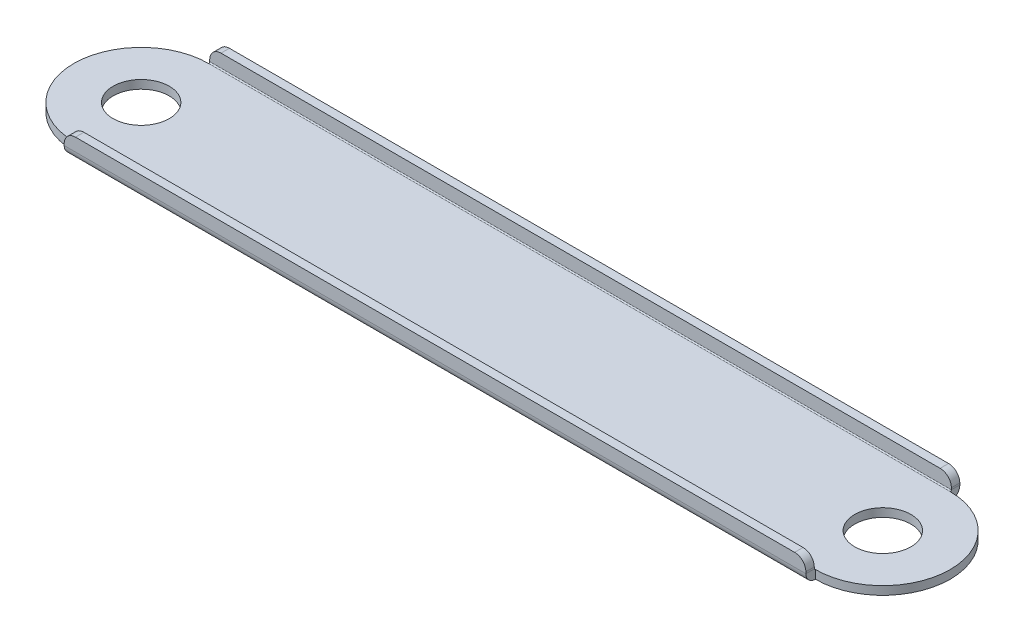
ISO-10303-21;
HEADER;
FILE_DESCRIPTION(('STEP AP214'),'2;1');
FILE_NAME('part.step','',(''),(''),'','','');
FILE_SCHEMA(('AUTOMOTIVE_DESIGN { 1 0 10303 214 1 1 1 1 }'));
ENDSEC;
DATA;
#1=APPLICATION_CONTEXT('core data for automotive mechanical design processes');
#2=APPLICATION_PROTOCOL_DEFINITION('international standard','automotive_design',2000,#1);
#3=PRODUCT_CONTEXT('',#1,'mechanical');
#4=PRODUCT('Part','Part','',(#3));
#5=PRODUCT_RELATED_PRODUCT_CATEGORY('part','',(#4));
#6=PRODUCT_DEFINITION_FORMATION('','',#4);
#7=PRODUCT_DEFINITION_CONTEXT('part definition',#1,'design');
#8=PRODUCT_DEFINITION('design','',#6,#7);
#9=PRODUCT_DEFINITION_SHAPE('','',#8);
#10=(LENGTH_UNIT() NAMED_UNIT(*) SI_UNIT(.MILLI.,.METRE.));
#11=(NAMED_UNIT(*) PLANE_ANGLE_UNIT() SI_UNIT($,.RADIAN.));
#12=(NAMED_UNIT(*) SI_UNIT($,.STERADIAN.) SOLID_ANGLE_UNIT());
#13=UNCERTAINTY_MEASURE_WITH_UNIT(LENGTH_MEASURE(1.E-05),#10,'distance_accuracy_value','');
#14=(GEOMETRIC_REPRESENTATION_CONTEXT(3) GLOBAL_UNCERTAINTY_ASSIGNED_CONTEXT((#13)) GLOBAL_UNIT_ASSIGNED_CONTEXT((#10,
#11,#12)) REPRESENTATION_CONTEXT('',''));
#15=CARTESIAN_POINT('',(0.,0.,0.));
#16=DIRECTION('',(0.,0.,1.));
#17=DIRECTION('',(1.,0.,0.));
#18=AXIS2_PLACEMENT_3D('',#15,#16,#17);
#19=CARTESIAN_POINT('',(-33.0009469561102,-0.75,0.));
#20=DIRECTION('',(0.,1.,0.));
#21=DIRECTION('',(0.,0.,1.));
#22=AXIS2_PLACEMENT_3D('',#19,#20,#21);
#23=CYLINDRICAL_SURFACE('',#22,6.);
#24=CARTESIAN_POINT('',(-33.0009469561102,0.,0.));
#25=DIRECTION('',(0.,1.,0.));
#26=DIRECTION('',(0.,0.,1.));
#27=AXIS2_PLACEMENT_3D('',#24,#25,#26);
#28=CIRCLE('',#27,6.);
#29=CARTESIAN_POINT('',(-33.0009469561102,0.,-6.));
#30=VERTEX_POINT('',#29);
#31=CARTESIAN_POINT('',(-33.0009469561102,0.,6.));
#32=VERTEX_POINT('',#31);
#33=EDGE_CURVE('E298',#30,#32,#28,.T.);
#34=ORIENTED_EDGE('',*,*,#33,.F.);
#35=DIRECTION('',(0.,1.,0.));
#36=VECTOR('',#35,1.);
#37=CARTESIAN_POINT('',(-33.0009469561102,-0.75,-6.));
#38=LINE('',#37,#36);
#39=CARTESIAN_POINT('',(-33.0009469561102,-0.750000000000001,-5.99999999999995));
#40=VERTEX_POINT('',#39);
#41=EDGE_CURVE('E322',#40,#30,#38,.T.);
#42=ORIENTED_EDGE('',*,*,#41,.F.);
#43=CARTESIAN_POINT('',(-33.0009469561102,-0.75,0.));
#44=DIRECTION('',(0.,1.,0.));
#45=DIRECTION('',(0.,0.,1.));
#46=AXIS2_PLACEMENT_3D('',#43,#44,#45);
#47=CIRCLE('',#46,6.);
#48=CARTESIAN_POINT('',(-33.0009469561102,-0.75,6.));
#49=VERTEX_POINT('',#48);
#50=EDGE_CURVE('E301',#40,#49,#47,.T.);
#51=ORIENTED_EDGE('',*,*,#50,.T.);
#52=DIRECTION('',(0.,1.,0.));
#53=VECTOR('',#52,1.);
#54=CARTESIAN_POINT('',(-33.0009469561102,-0.75,6.));
#55=LINE('',#54,#53);
#56=EDGE_CURVE('E311',#49,#32,#55,.T.);
#57=ORIENTED_EDGE('',*,*,#56,.T.);
#58=EDGE_LOOP('',(#34,#42,#51,#57));
#59=FACE_BOUND('',#58,.T.);
#60=ADVANCED_FACE('F78',(#59),#23,.T.);
#61=CARTESIAN_POINT('',(33.0009469561102,-0.75,0.));
#62=DIRECTION('',(0.,1.,0.));
#63=DIRECTION('',(0.,0.,1.));
#64=AXIS2_PLACEMENT_3D('',#61,#62,#63);
#65=CYLINDRICAL_SURFACE('',#64,6.);
#66=CARTESIAN_POINT('',(33.0009469561102,0.,0.));
#67=DIRECTION('',(0.,1.,0.));
#68=DIRECTION('',(0.,0.,1.));
#69=AXIS2_PLACEMENT_3D('',#66,#67,#68);
#70=CIRCLE('',#69,6.);
#71=CARTESIAN_POINT('',(33.0009469561102,0.,5.99999999999999));
#72=VERTEX_POINT('',#71);
#73=CARTESIAN_POINT('',(33.0009469561102,0.,-6.00000000000001));
#74=VERTEX_POINT('',#73);
#75=EDGE_CURVE('E317',#72,#74,#70,.T.);
#76=ORIENTED_EDGE('',*,*,#75,.F.);
#77=DIRECTION('',(0.,1.,0.));
#78=VECTOR('',#77,1.);
#79=CARTESIAN_POINT('',(33.0009469561102,-0.75,5.99999999999999));
#80=LINE('',#79,#78);
#81=CARTESIAN_POINT('',(33.0009469561102,-0.750000000000009,5.99999999999994));
#82=VERTEX_POINT('',#81);
#83=EDGE_CURVE('E327',#82,#72,#80,.T.);
#84=ORIENTED_EDGE('',*,*,#83,.F.);
#85=CARTESIAN_POINT('',(33.0009469561102,-0.75,0.));
#86=DIRECTION('',(0.,1.,0.));
#87=DIRECTION('',(0.,0.,1.));
#88=AXIS2_PLACEMENT_3D('',#85,#86,#87);
#89=CIRCLE('',#88,6.);
#90=CARTESIAN_POINT('',(33.0009469561102,-0.75,-6.00000000000001));
#91=VERTEX_POINT('',#90);
#92=EDGE_CURVE('E308',#82,#91,#89,.T.);
#93=ORIENTED_EDGE('',*,*,#92,.T.);
#94=DIRECTION('',(0.,1.,0.));
#95=VECTOR('',#94,1.);
#96=CARTESIAN_POINT('',(33.0009469561102,-0.75,-6.00000000000001));
#97=LINE('',#96,#95);
#98=EDGE_CURVE('E325',#91,#74,#97,.T.);
#99=ORIENTED_EDGE('',*,*,#98,.T.);
#100=EDGE_LOOP('',(#76,#84,#93,#99));
#101=FACE_BOUND('',#100,.T.);
#102=ADVANCED_FACE('F394',(#101),#65,.T.);
#103=CARTESIAN_POINT('',(-33.0009469561102,-0.75,0.));
#104=DIRECTION('',(0.,1.,0.));
#105=DIRECTION('',(0.,0.,1.));
#106=AXIS2_PLACEMENT_3D('',#103,#104,#105);
#107=PLANE('',#106);
#108=CARTESIAN_POINT('',(-33.0009469561102,-0.75,0.));
#109=DIRECTION('',(0.,1.,0.));
#110=DIRECTION('',(0.,0.,1.));
#111=AXIS2_PLACEMENT_3D('',#108,#109,#110);
#112=CIRCLE('',#111,2.5);
#113=CARTESIAN_POINT('',(-33.0009469561102,-0.75,2.50000000000001));
#114=VERTEX_POINT('',#113);
#115=EDGE_CURVE('E289',#114,#114,#112,.T.);
#116=ORIENTED_EDGE('',*,*,#115,.T.);
#117=EDGE_LOOP('',(#116));
#118=FACE_BOUND('',#117,.T.);
#119=CARTESIAN_POINT('',(33.0009469561102,-0.75,0.));
#120=DIRECTION('',(0.,1.,0.));
#121=DIRECTION('',(0.,0.,1.));
#122=AXIS2_PLACEMENT_3D('',#119,#120,#121);
#123=CIRCLE('',#122,2.5);
#124=CARTESIAN_POINT('',(33.0009469561102,-0.75,2.49999999999999));
#125=VERTEX_POINT('',#124);
#126=EDGE_CURVE('E295',#125,#125,#123,.T.);
#127=ORIENTED_EDGE('',*,*,#126,.T.);
#128=EDGE_LOOP('',(#127));
#129=FACE_BOUND('',#128,.T.);
#130=ORIENTED_EDGE('',*,*,#50,.F.);
#131=DIRECTION('',(-1.,0.,0.));
#132=VECTOR('',#131,1.);
#133=CARTESIAN_POINT('',(-33.0009469561102,-0.75,-6.));
#134=LINE('',#133,#132);
#135=EDGE_CURVE('E217',#91,#40,#134,.T.);
#136=ORIENTED_EDGE('',*,*,#135,.F.);
#137=ORIENTED_EDGE('',*,*,#92,.F.);
#138=DIRECTION('',(1.,0.,0.));
#139=VECTOR('',#138,1.);
#140=CARTESIAN_POINT('',(-33.0009469561102,-0.75,6.));
#141=LINE('',#140,#139);
#142=EDGE_CURVE('E304',#49,#82,#141,.T.);
#143=ORIENTED_EDGE('',*,*,#142,.F.);
#144=EDGE_LOOP('',(#130,#136,#137,#143));
#145=FACE_BOUND('',#144,.T.);
#146=ADVANCED_FACE('F396',(#118,#129,#145),#107,.F.);
#147=CARTESIAN_POINT('',(-33.0009469561102,0.,0.));
#148=DIRECTION('',(0.,1.,0.));
#149=DIRECTION('',(0.,0.,1.));
#150=AXIS2_PLACEMENT_3D('',#147,#148,#149);
#151=PLANE('',#150);
#152=CARTESIAN_POINT('',(-33.0009469561102,0.,0.));
#153=DIRECTION('',(0.,1.,0.));
#154=DIRECTION('',(0.,0.,1.));
#155=AXIS2_PLACEMENT_3D('',#152,#153,#154);
#156=CIRCLE('',#155,2.5);
#157=CARTESIAN_POINT('',(-33.0009469561102,0.,2.50000000000001));
#158=VERTEX_POINT('',#157);
#159=EDGE_CURVE('E280',#158,#158,#156,.T.);
#160=ORIENTED_EDGE('',*,*,#159,.F.);
#161=EDGE_LOOP('',(#160));
#162=FACE_BOUND('',#161,.T.);
#163=CARTESIAN_POINT('',(33.0009469561102,0.,0.));
#164=DIRECTION('',(0.,1.,0.));
#165=DIRECTION('',(0.,0.,1.));
#166=AXIS2_PLACEMENT_3D('',#163,#164,#165);
#167=CIRCLE('',#166,2.5);
#168=CARTESIAN_POINT('',(33.0009469561102,0.,2.49999999999999));
#169=VERTEX_POINT('',#168);
#170=EDGE_CURVE('E292',#169,#169,#167,.T.);
#171=ORIENTED_EDGE('',*,*,#170,.F.);
#172=EDGE_LOOP('',(#171));
#173=FACE_BOUND('',#172,.T.);
#174=ORIENTED_EDGE('',*,*,#33,.T.);
#175=DIRECTION('',(1.,0.,0.));
#176=VECTOR('',#175,1.);
#177=CARTESIAN_POINT('',(-33.0009469561102,0.,6.));
#178=LINE('',#177,#176);
#179=EDGE_CURVE('E314',#32,#72,#178,.T.);
#180=ORIENTED_EDGE('',*,*,#179,.T.);
#181=ORIENTED_EDGE('',*,*,#75,.T.);
#182=DIRECTION('',(-1.,0.,0.));
#183=VECTOR('',#182,1.);
#184=CARTESIAN_POINT('',(-33.0009469561102,0.,-6.));
#185=LINE('',#184,#183);
#186=EDGE_CURVE('E305',#74,#30,#185,.T.);
#187=ORIENTED_EDGE('',*,*,#186,.T.);
#188=EDGE_LOOP('',(#174,#180,#181,#187));
#189=FACE_BOUND('',#188,.T.);
#190=ADVANCED_FACE('F390',(#162,#173,#189),#151,.T.);
#191=CARTESIAN_POINT('',(33.0009469561102,-0.75,0.));
#192=DIRECTION('',(0.,1.,0.));
#193=DIRECTION('',(0.,0.,1.));
#194=AXIS2_PLACEMENT_3D('',#191,#192,#193);
#195=CYLINDRICAL_SURFACE('',#194,2.5);
#196=ORIENTED_EDGE('',*,*,#126,.F.);
#197=EDGE_LOOP('',(#196));
#198=FACE_BOUND('',#197,.T.);
#199=ORIENTED_EDGE('',*,*,#170,.T.);
#200=EDGE_LOOP('',(#199));
#201=FACE_BOUND('',#200,.T.);
#202=ADVANCED_FACE('F441',(#198,#201),#195,.F.);
#203=CARTESIAN_POINT('',(-33.0009469561102,-0.75,0.));
#204=DIRECTION('',(0.,1.,0.));
#205=DIRECTION('',(0.,0.,1.));
#206=AXIS2_PLACEMENT_3D('',#203,#204,#205);
#207=CYLINDRICAL_SURFACE('',#206,2.5);
#208=ORIENTED_EDGE('',*,*,#115,.F.);
#209=EDGE_LOOP('',(#208));
#210=FACE_BOUND('',#209,.T.);
#211=ORIENTED_EDGE('',*,*,#159,.T.);
#212=EDGE_LOOP('',(#211));
#213=FACE_BOUND('',#212,.T.);
#214=ADVANCED_FACE('F448',(#210,#213),#207,.F.);
#215=CARTESIAN_POINT('',(-33.0009469561102,0.0999999999999977,5.99999999999999));
#216=DIRECTION('',(-1.,0.,0.));
#217=DIRECTION('',(0.,0.,1.));
#218=AXIS2_PLACEMENT_3D('',#215,#216,#217);
#219=PLANE('',#218);
#220=DIRECTION('',(0.,0.,1.));
#221=VECTOR('',#220,1.);
#222=CARTESIAN_POINT('',(-33.0009469561102,0.0999999999999994,6.85));
#223=LINE('',#222,#221);
#224=CARTESIAN_POINT('',(-33.0009469561102,0.0999999999999972,6.1));
#225=VERTEX_POINT('',#224);
#226=CARTESIAN_POINT('',(-33.0009469561102,0.0999999999999941,6.85));
#227=VERTEX_POINT('',#226);
#228=EDGE_CURVE('E245',#225,#227,#223,.T.);
#229=ORIENTED_EDGE('',*,*,#228,.F.);
#230=CARTESIAN_POINT('',(-33.0009469561102,0.0999999999999977,5.99999999999999));
#231=DIRECTION('',(1.,0.,0.));
#232=DIRECTION('',(0.,0.,-1.));
#233=AXIS2_PLACEMENT_3D('',#230,#231,#232);
#234=CIRCLE('',#233,0.100000000000006);
#235=EDGE_CURVE('E284',#32,#225,#234,.F.);
#236=ORIENTED_EDGE('',*,*,#235,.F.);
#237=ORIENTED_EDGE('',*,*,#56,.F.);
#238=CARTESIAN_POINT('',(-33.0009469561102,0.0999999999999977,5.99999999999999));
#239=DIRECTION('',(1.,0.,0.));
#240=DIRECTION('',(0.,0.,-1.));
#241=AXIS2_PLACEMENT_3D('',#238,#239,#240);
#242=CIRCLE('',#241,0.850000000000006);
#243=EDGE_CURVE('E277',#49,#227,#242,.F.);
#244=ORIENTED_EDGE('',*,*,#243,.T.);
#245=EDGE_LOOP('',(#229,#236,#237,#244));
#246=FACE_BOUND('',#245,.T.);
#247=ADVANCED_FACE('F380',(#246),#219,.T.);
#248=CARTESIAN_POINT('',(33.0009469561102,0.0999999999999977,5.99999999999999));
#249=DIRECTION('',(-1.,0.,0.));
#250=DIRECTION('',(0.,0.,1.));
#251=AXIS2_PLACEMENT_3D('',#248,#249,#250);
#252=PLANE('',#251);
#253=CARTESIAN_POINT('',(33.0009469561102,0.0999999999999977,5.99999999999999));
#254=DIRECTION('',(1.,0.,0.));
#255=DIRECTION('',(0.,0.,-1.));
#256=AXIS2_PLACEMENT_3D('',#253,#254,#255);
#257=CIRCLE('',#256,0.100000000000006);
#258=CARTESIAN_POINT('',(33.0009469561102,0.0999999999999972,6.1));
#259=VERTEX_POINT('',#258);
#260=EDGE_CURVE('E252',#259,#72,#257,.T.);
#261=ORIENTED_EDGE('',*,*,#260,.F.);
#262=DIRECTION('',(0.,0.,1.));
#263=VECTOR('',#262,1.);
#264=CARTESIAN_POINT('',(33.0009469561102,0.0999999999999959,6.09999999999999));
#265=LINE('',#264,#263);
#266=CARTESIAN_POINT('',(33.0009469561102,0.0999999999999959,6.84999999999999));
#267=VERTEX_POINT('',#266);
#268=EDGE_CURVE('E269',#259,#267,#265,.T.);
#269=ORIENTED_EDGE('',*,*,#268,.T.);
#270=CARTESIAN_POINT('',(33.0009469561102,0.0999999999999977,5.99999999999999));
#271=DIRECTION('',(1.,0.,0.));
#272=DIRECTION('',(0.,0.,-1.));
#273=AXIS2_PLACEMENT_3D('',#270,#271,#272);
#274=CIRCLE('',#273,0.850000000000006);
#275=EDGE_CURVE('E281',#267,#82,#274,.T.);
#276=ORIENTED_EDGE('',*,*,#275,.T.);
#277=ORIENTED_EDGE('',*,*,#83,.T.);
#278=EDGE_LOOP('',(#261,#269,#276,#277));
#279=FACE_BOUND('',#278,.T.);
#280=ADVANCED_FACE('F374',(#279),#252,.F.);
#281=CARTESIAN_POINT('',(33.0009469561102,0.0999999999999977,5.99999999999999));
#282=DIRECTION('',(1.,0.,0.));
#283=DIRECTION('',(0.,0.,1.));
#284=AXIS2_PLACEMENT_3D('',#281,#282,#283);
#285=CYLINDRICAL_SURFACE('',#284,0.850000000000006);
#286=ORIENTED_EDGE('',*,*,#142,.T.);
#287=ORIENTED_EDGE('',*,*,#275,.F.);
#288=DIRECTION('',(1.,0.,0.));
#289=VECTOR('',#288,1.);
#290=CARTESIAN_POINT('',(0.,0.0999999999999977,6.84999999999999));
#291=LINE('',#290,#289);
#292=EDGE_CURVE('E266',#227,#267,#291,.T.);
#293=ORIENTED_EDGE('',*,*,#292,.F.);
#294=ORIENTED_EDGE('',*,*,#243,.F.);
#295=EDGE_LOOP('',(#286,#287,#293,#294));
#296=FACE_BOUND('',#295,.T.);
#297=ADVANCED_FACE('F377',(#296),#285,.T.);
#298=CARTESIAN_POINT('',(33.0009469561102,0.0999999999999977,5.99999999999999));
#299=DIRECTION('',(1.,0.,0.));
#300=DIRECTION('',(0.,0.,1.));
#301=AXIS2_PLACEMENT_3D('',#298,#299,#300);
#302=CYLINDRICAL_SURFACE('',#301,0.100000000000006);
#303=ORIENTED_EDGE('',*,*,#179,.F.);
#304=ORIENTED_EDGE('',*,*,#235,.T.);
#305=DIRECTION('',(-1.,0.,0.));
#306=VECTOR('',#305,1.);
#307=CARTESIAN_POINT('',(-33.0009469561102,0.0999999999999994,6.1));
#308=LINE('',#307,#306);
#309=EDGE_CURVE('E272',#225,#259,#308,.F.);
#310=ORIENTED_EDGE('',*,*,#309,.T.);
#311=ORIENTED_EDGE('',*,*,#260,.T.);
#312=EDGE_LOOP('',(#303,#304,#310,#311));
#313=FACE_BOUND('',#312,.T.);
#314=ADVANCED_FACE('F388',(#313),#302,.F.);
#315=CARTESIAN_POINT('',(33.0009469561102,0.,6.84999999999999));
#316=DIRECTION('',(1.,0.,0.));
#317=DIRECTION('',(0.,0.,-1.));
#318=AXIS2_PLACEMENT_3D('',#315,#316,#317);
#319=PLANE('',#318);
#320=DIRECTION('',(0.,1.,0.));
#321=VECTOR('',#320,1.);
#322=CARTESIAN_POINT('',(33.0009469561102,0.,6.09999999999999));
#323=LINE('',#322,#321);
#324=CARTESIAN_POINT('',(33.0009469561102,0.250000000000003,6.09999999999999));
#325=VERTEX_POINT('',#324);
#326=EDGE_CURVE('E258',#325,#259,#323,.F.);
#327=ORIENTED_EDGE('',*,*,#326,.F.);
#328=DIRECTION('',(0.,0.,-1.));
#329=VECTOR('',#328,1.);
#330=CARTESIAN_POINT('',(33.0009469561102,0.25,6.84999999999999));
#331=LINE('',#330,#329);
#332=CARTESIAN_POINT('',(33.0009469561102,0.25,6.84999999999999));
#333=VERTEX_POINT('',#332);
#334=EDGE_CURVE('E101',#325,#333,#331,.F.);
#335=ORIENTED_EDGE('',*,*,#334,.T.);
#336=DIRECTION('',(0.,-1.,0.));
#337=VECTOR('',#336,1.);
#338=CARTESIAN_POINT('',(33.0009469561102,0.,6.84999999999999));
#339=LINE('',#338,#337);
#340=EDGE_CURVE('E250',#333,#267,#339,.T.);
#341=ORIENTED_EDGE('',*,*,#340,.T.);
#342=ORIENTED_EDGE('',*,*,#268,.F.);
#343=EDGE_LOOP('',(#327,#335,#341,#342));
#344=FACE_BOUND('',#343,.T.);
#345=ADVANCED_FACE('F370',(#344),#319,.T.);
#346=CARTESIAN_POINT('',(-33.0009469561102,1.25,6.85));
#347=DIRECTION('',(-1.,0.,0.));
#348=DIRECTION('',(0.,0.,1.));
#349=AXIS2_PLACEMENT_3D('',#346,#347,#348);
#350=PLANE('',#349);
#351=DIRECTION('',(0.,1.,0.));
#352=VECTOR('',#351,1.);
#353=CARTESIAN_POINT('',(-33.0009469561102,1.25,6.85));
#354=LINE('',#353,#352);
#355=CARTESIAN_POINT('',(-33.0009469561102,0.25,6.85));
#356=VERTEX_POINT('',#355);
#357=EDGE_CURVE('E256',#227,#356,#354,.T.);
#358=ORIENTED_EDGE('',*,*,#357,.T.);
#359=DIRECTION('',(0.,0.,-1.));
#360=VECTOR('',#359,1.);
#361=CARTESIAN_POINT('',(-33.0009469561102,0.25,6.85));
#362=LINE('',#361,#360);
#363=CARTESIAN_POINT('',(-33.0009469561102,0.250000000000003,6.1));
#364=VERTEX_POINT('',#363);
#365=EDGE_CURVE('E13',#356,#364,#362,.T.);
#366=ORIENTED_EDGE('',*,*,#365,.T.);
#367=DIRECTION('',(0.,-1.,0.));
#368=VECTOR('',#367,1.);
#369=CARTESIAN_POINT('',(-33.0009469561102,0.,6.1));
#370=LINE('',#369,#368);
#371=EDGE_CURVE('E263',#225,#364,#370,.F.);
#372=ORIENTED_EDGE('',*,*,#371,.F.);
#373=ORIENTED_EDGE('',*,*,#228,.T.);
#374=EDGE_LOOP('',(#358,#366,#372,#373));
#375=FACE_BOUND('',#374,.T.);
#376=ADVANCED_FACE('F384',(#375),#350,.T.);
#377=CARTESIAN_POINT('',(0.,0.,6.84999999999999));
#378=DIRECTION('',(0.,0.,1.));
#379=DIRECTION('',(0.,-1.,0.));
#380=AXIS2_PLACEMENT_3D('',#377,#378,#379);
#381=PLANE('',#380);
#382=ORIENTED_EDGE('',*,*,#340,.F.);
#383=CARTESIAN_POINT('',(32.0009469561102,0.25,6.84999999999999));
#384=DIRECTION('',(0.,0.,1.));
#385=DIRECTION('',(0.,-1.,0.));
#386=AXIS2_PLACEMENT_3D('',#383,#384,#385);
#387=CIRCLE('',#386,1.);
#388=CARTESIAN_POINT('',(32.0009469561102,1.25,6.84999999999999));
#389=VERTEX_POINT('',#388);
#390=EDGE_CURVE('E86',#333,#389,#387,.T.);
#391=ORIENTED_EDGE('',*,*,#390,.T.);
#392=DIRECTION('',(1.,0.,0.));
#393=VECTOR('',#392,1.);
#394=CARTESIAN_POINT('',(33.0009469561102,1.25,6.84999999999999));
#395=LINE('',#394,#393);
#396=CARTESIAN_POINT('',(-32.0009469561102,1.25,6.85));
#397=VERTEX_POINT('',#396);
#398=EDGE_CURVE('E253',#397,#389,#395,.T.);
#399=ORIENTED_EDGE('',*,*,#398,.F.);
#400=CARTESIAN_POINT('',(-32.0009469561102,0.25,6.85));
#401=DIRECTION('',(0.,0.,1.));
#402=DIRECTION('',(0.,-1.,0.));
#403=AXIS2_PLACEMENT_3D('',#400,#401,#402);
#404=CIRCLE('',#403,1.);
#405=EDGE_CURVE('E93',#397,#356,#404,.T.);
#406=ORIENTED_EDGE('',*,*,#405,.T.);
#407=ORIENTED_EDGE('',*,*,#357,.F.);
#408=ORIENTED_EDGE('',*,*,#292,.T.);
#409=EDGE_LOOP('',(#382,#391,#399,#406,#407,#408));
#410=FACE_BOUND('',#409,.T.);
#411=ADVANCED_FACE('F358',(#410),#381,.T.);
#412=CARTESIAN_POINT('',(0.,0.,6.09999999999999));
#413=DIRECTION('',(0.,0.,1.));
#414=DIRECTION('',(0.,-1.,0.));
#415=AXIS2_PLACEMENT_3D('',#412,#413,#414);
#416=PLANE('',#415);
#417=DIRECTION('',(-1.,0.,0.));
#418=VECTOR('',#417,1.);
#419=CARTESIAN_POINT('',(0.,1.25,6.1));
#420=LINE('',#419,#418);
#421=CARTESIAN_POINT('',(-32.0009469561102,1.25,6.1));
#422=VERTEX_POINT('',#421);
#423=CARTESIAN_POINT('',(32.0009469561102,1.25,6.09999999999999));
#424=VERTEX_POINT('',#423);
#425=EDGE_CURVE('E260',#422,#424,#420,.F.);
#426=ORIENTED_EDGE('',*,*,#425,.T.);
#427=CARTESIAN_POINT('',(32.0009469561102,0.250000000000003,6.09999999999999));
#428=DIRECTION('',(0.,0.,1.));
#429=DIRECTION('',(0.,-1.,0.));
#430=AXIS2_PLACEMENT_3D('',#427,#428,#429);
#431=CIRCLE('',#430,1.);
#432=EDGE_CURVE('E354',#424,#325,#431,.F.);
#433=ORIENTED_EDGE('',*,*,#432,.T.);
#434=ORIENTED_EDGE('',*,*,#326,.T.);
#435=ORIENTED_EDGE('',*,*,#309,.F.);
#436=ORIENTED_EDGE('',*,*,#371,.T.);
#437=CARTESIAN_POINT('',(-32.0009469561102,0.250000000000003,6.1));
#438=DIRECTION('',(0.,0.,1.));
#439=DIRECTION('',(0.,-1.,0.));
#440=AXIS2_PLACEMENT_3D('',#437,#438,#439);
#441=CIRCLE('',#440,1.);
#442=EDGE_CURVE('E352',#364,#422,#441,.F.);
#443=ORIENTED_EDGE('',*,*,#442,.T.);
#444=EDGE_LOOP('',(#426,#433,#434,#435,#436,#443));
#445=FACE_BOUND('',#444,.T.);
#446=ADVANCED_FACE('F367',(#445),#416,.F.);
#447=CARTESIAN_POINT('',(33.0009469561102,1.25,6.84999999999999));
#448=DIRECTION('',(0.,1.,0.));
#449=DIRECTION('',(0.,0.,1.));
#450=AXIS2_PLACEMENT_3D('',#447,#448,#449);
#451=PLANE('',#450);
#452=ORIENTED_EDGE('',*,*,#398,.T.);
#453=DIRECTION('',(0.,0.,-1.));
#454=VECTOR('',#453,1.);
#455=CARTESIAN_POINT('',(32.0009469561102,1.25,6.84999999999999));
#456=LINE('',#455,#454);
#457=EDGE_CURVE('E349',#389,#424,#456,.T.);
#458=ORIENTED_EDGE('',*,*,#457,.T.);
#459=ORIENTED_EDGE('',*,*,#425,.F.);
#460=DIRECTION('',(0.,0.,-1.));
#461=VECTOR('',#460,1.);
#462=CARTESIAN_POINT('',(-32.0009469561102,1.25,6.85));
#463=LINE('',#462,#461);
#464=EDGE_CURVE('E347',#422,#397,#463,.F.);
#465=ORIENTED_EDGE('',*,*,#464,.T.);
#466=EDGE_LOOP('',(#452,#458,#459,#465));
#467=FACE_BOUND('',#466,.T.);
#468=ADVANCED_FACE('F362',(#467),#451,.T.);
#469=CARTESIAN_POINT('',(33.0009469561102,0.0999999999999987,-6.00000000000001));
#470=DIRECTION('',(1.,0.,0.));
#471=DIRECTION('',(0.,0.,-1.));
#472=AXIS2_PLACEMENT_3D('',#469,#470,#471);
#473=PLANE('',#472);
#474=DIRECTION('',(0.,0.,-1.));
#475=VECTOR('',#474,1.);
#476=CARTESIAN_POINT('',(33.0009469561102,0.100000000000005,-6.85));
#477=LINE('',#476,#475);
#478=CARTESIAN_POINT('',(33.0009469561102,0.0999999999999987,-6.10000000000001));
#479=VERTEX_POINT('',#478);
#480=CARTESIAN_POINT('',(33.0009469561102,0.0999999999999987,-6.85));
#481=VERTEX_POINT('',#480);
#482=EDGE_CURVE('E242',#479,#481,#477,.T.);
#483=ORIENTED_EDGE('',*,*,#482,.F.);
#484=CARTESIAN_POINT('',(33.0009469561102,0.0999999999999987,-6.00000000000001));
#485=DIRECTION('',(-1.,0.,0.));
#486=DIRECTION('',(0.,0.,1.));
#487=AXIS2_PLACEMENT_3D('',#484,#485,#486);
#488=CIRCLE('',#487,0.0999999999999994);
#489=EDGE_CURVE('E221',#74,#479,#488,.F.);
#490=ORIENTED_EDGE('',*,*,#489,.F.);
#491=ORIENTED_EDGE('',*,*,#98,.F.);
#492=CARTESIAN_POINT('',(33.0009469561102,0.0999999999999987,-6.00000000000001));
#493=DIRECTION('',(-1.,0.,0.));
#494=DIRECTION('',(0.,0.,1.));
#495=AXIS2_PLACEMENT_3D('',#492,#493,#494);
#496=CIRCLE('',#495,0.849999999999999);
#497=EDGE_CURVE('E220',#91,#481,#496,.F.);
#498=ORIENTED_EDGE('',*,*,#497,.T.);
#499=EDGE_LOOP('',(#483,#490,#491,#498));
#500=FACE_BOUND('',#499,.T.);
#501=ADVANCED_FACE('F465',(#500),#473,.T.);
#502=CARTESIAN_POINT('',(-33.0009469561102,0.0999999999999987,-6.00000000000001));
#503=DIRECTION('',(1.,0.,0.));
#504=DIRECTION('',(0.,0.,-1.));
#505=AXIS2_PLACEMENT_3D('',#502,#503,#504);
#506=PLANE('',#505);
#507=CARTESIAN_POINT('',(-33.0009469561102,0.0999999999999987,-6.00000000000001));
#508=DIRECTION('',(-1.,0.,0.));
#509=DIRECTION('',(0.,0.,1.));
#510=AXIS2_PLACEMENT_3D('',#507,#508,#509);
#511=CIRCLE('',#510,0.0999999999999994);
#512=CARTESIAN_POINT('',(-33.0009469561102,0.0999999999999987,-6.10000000000001));
#513=VERTEX_POINT('',#512);
#514=EDGE_CURVE('E205',#513,#30,#511,.T.);
#515=ORIENTED_EDGE('',*,*,#514,.F.);
#516=DIRECTION('',(0.,0.,-1.));
#517=VECTOR('',#516,1.);
#518=CARTESIAN_POINT('',(-33.0009469561102,0.0999999999999994,-6.10000000000001));
#519=LINE('',#518,#517);
#520=CARTESIAN_POINT('',(-33.0009469561102,0.100000000000005,-6.85));
#521=VERTEX_POINT('',#520);
#522=EDGE_CURVE('E199',#513,#521,#519,.T.);
#523=ORIENTED_EDGE('',*,*,#522,.T.);
#524=CARTESIAN_POINT('',(-33.0009469561102,0.0999999999999987,-6.00000000000001));
#525=DIRECTION('',(-1.,0.,0.));
#526=DIRECTION('',(0.,0.,1.));
#527=AXIS2_PLACEMENT_3D('',#524,#525,#526);
#528=CIRCLE('',#527,0.849999999999999);
#529=EDGE_CURVE('E211',#521,#40,#528,.T.);
#530=ORIENTED_EDGE('',*,*,#529,.T.);
#531=ORIENTED_EDGE('',*,*,#41,.T.);
#532=EDGE_LOOP('',(#515,#523,#530,#531));
#533=FACE_BOUND('',#532,.T.);
#534=ADVANCED_FACE('F224',(#533),#506,.F.);
#535=CARTESIAN_POINT('',(-33.0009469561102,0.0999999999999987,-6.00000000000001));
#536=DIRECTION('',(-1.,0.,0.));
#537=DIRECTION('',(0.,0.,-1.));
#538=AXIS2_PLACEMENT_3D('',#535,#536,#537);
#539=CYLINDRICAL_SURFACE('',#538,0.849999999999999);
#540=ORIENTED_EDGE('',*,*,#135,.T.);
#541=ORIENTED_EDGE('',*,*,#529,.F.);
#542=DIRECTION('',(-1.,0.,0.));
#543=VECTOR('',#542,1.);
#544=CARTESIAN_POINT('',(33.0009469561102,0.100000000000005,-6.85));
#545=LINE('',#544,#543);
#546=EDGE_CURVE('E214',#521,#481,#545,.F.);
#547=ORIENTED_EDGE('',*,*,#546,.T.);
#548=ORIENTED_EDGE('',*,*,#497,.F.);
#549=EDGE_LOOP('',(#540,#541,#547,#548));
#550=FACE_BOUND('',#549,.T.);
#551=ADVANCED_FACE('F212',(#550),#539,.T.);
#552=CARTESIAN_POINT('',(-33.0009469561102,0.0999999999999987,-6.00000000000001));
#553=DIRECTION('',(-1.,0.,0.));
#554=DIRECTION('',(0.,0.,-1.));
#555=AXIS2_PLACEMENT_3D('',#552,#553,#554);
#556=CYLINDRICAL_SURFACE('',#555,0.0999999999999994);
#557=ORIENTED_EDGE('',*,*,#186,.F.);
#558=ORIENTED_EDGE('',*,*,#489,.T.);
#559=DIRECTION('',(-1.,0.,0.));
#560=VECTOR('',#559,1.);
#561=CARTESIAN_POINT('',(33.0009469561102,0.0999999999999994,-6.10000000000001));
#562=LINE('',#561,#560);
#563=EDGE_CURVE('E226',#479,#513,#562,.T.);
#564=ORIENTED_EDGE('',*,*,#563,.T.);
#565=ORIENTED_EDGE('',*,*,#514,.T.);
#566=EDGE_LOOP('',(#557,#558,#564,#565));
#567=FACE_BOUND('',#566,.T.);
#568=ADVANCED_FACE('F400',(#567),#556,.F.);
#569=CARTESIAN_POINT('',(33.0009469561102,0.,-6.85));
#570=DIRECTION('',(1.,0.,0.));
#571=DIRECTION('',(0.,0.,-1.));
#572=AXIS2_PLACEMENT_3D('',#569,#570,#571);
#573=PLANE('',#572);
#574=DIRECTION('',(0.,-1.,0.));
#575=VECTOR('',#574,1.);
#576=CARTESIAN_POINT('',(33.0009469561102,0.,-6.85));
#577=LINE('',#576,#575);
#578=CARTESIAN_POINT('',(33.0009469561102,0.250000000000003,-6.85));
#579=VERTEX_POINT('',#578);
#580=EDGE_CURVE('E232',#481,#579,#577,.F.);
#581=ORIENTED_EDGE('',*,*,#580,.T.);
#582=DIRECTION('',(0.,0.,1.));
#583=VECTOR('',#582,1.);
#584=CARTESIAN_POINT('',(33.0009469561102,0.250000000000003,-6.85));
#585=LINE('',#584,#583);
#586=CARTESIAN_POINT('',(33.0009469561102,0.250000000000003,-6.10000000000001));
#587=VERTEX_POINT('',#586);
#588=EDGE_CURVE('E324',#579,#587,#585,.T.);
#589=ORIENTED_EDGE('',*,*,#588,.T.);
#590=DIRECTION('',(0.,1.,0.));
#591=VECTOR('',#590,1.);
#592=CARTESIAN_POINT('',(33.0009469561102,0.,-6.10000000000001));
#593=LINE('',#592,#591);
#594=EDGE_CURVE('E233',#479,#587,#593,.T.);
#595=ORIENTED_EDGE('',*,*,#594,.F.);
#596=ORIENTED_EDGE('',*,*,#482,.T.);
#597=EDGE_LOOP('',(#581,#589,#595,#596));
#598=FACE_BOUND('',#597,.T.);
#599=ADVANCED_FACE('F408',(#598),#573,.T.);
#600=CARTESIAN_POINT('',(-33.0009469561102,1.25,-6.85));
#601=DIRECTION('',(-1.,0.,0.));
#602=DIRECTION('',(0.,0.,1.));
#603=AXIS2_PLACEMENT_3D('',#600,#601,#602);
#604=PLANE('',#603);
#605=DIRECTION('',(0.,-1.,0.));
#606=VECTOR('',#605,1.);
#607=CARTESIAN_POINT('',(-33.0009469561102,0.,-6.10000000000001));
#608=LINE('',#607,#606);
#609=CARTESIAN_POINT('',(-33.0009469561102,0.250000000000003,-6.10000000000001));
#610=VERTEX_POINT('',#609);
#611=EDGE_CURVE('E406',#610,#513,#608,.T.);
#612=ORIENTED_EDGE('',*,*,#611,.F.);
#613=DIRECTION('',(0.,0.,1.));
#614=VECTOR('',#613,1.);
#615=CARTESIAN_POINT('',(-33.0009469561102,0.250000000000003,-6.85));
#616=LINE('',#615,#614);
#617=CARTESIAN_POINT('',(-33.0009469561102,0.250000000000003,-6.85));
#618=VERTEX_POINT('',#617);
#619=EDGE_CURVE('E201',#610,#618,#616,.F.);
#620=ORIENTED_EDGE('',*,*,#619,.T.);
#621=DIRECTION('',(0.,1.,0.));
#622=VECTOR('',#621,1.);
#623=CARTESIAN_POINT('',(-33.0009469561102,1.25,-6.85));
#624=LINE('',#623,#622);
#625=EDGE_CURVE('E194',#618,#521,#624,.F.);
#626=ORIENTED_EDGE('',*,*,#625,.T.);
#627=ORIENTED_EDGE('',*,*,#522,.F.);
#628=EDGE_LOOP('',(#612,#620,#626,#627));
#629=FACE_BOUND('',#628,.T.);
#630=ADVANCED_FACE('F197',(#629),#604,.T.);
#631=CARTESIAN_POINT('',(0.,0.,-6.85));
#632=DIRECTION('',(0.,0.,1.));
#633=DIRECTION('',(1.,0.,0.));
#634=AXIS2_PLACEMENT_3D('',#631,#632,#633);
#635=PLANE('',#634);
#636=DIRECTION('',(1.,0.,0.));
#637=VECTOR('',#636,1.);
#638=CARTESIAN_POINT('',(33.0009469561102,1.25,-6.85));
#639=LINE('',#638,#637);
#640=CARTESIAN_POINT('',(32.0009469561102,1.25,-6.85));
#641=VERTEX_POINT('',#640);
#642=CARTESIAN_POINT('',(-32.0009469561102,1.25,-6.85));
#643=VERTEX_POINT('',#642);
#644=EDGE_CURVE('E206',#641,#643,#639,.F.);
#645=ORIENTED_EDGE('',*,*,#644,.F.);
#646=CARTESIAN_POINT('',(32.0009469561102,0.250000000000003,-6.85));
#647=DIRECTION('',(0.,0.,1.));
#648=DIRECTION('',(1.,0.,0.));
#649=AXIS2_PLACEMENT_3D('',#646,#647,#648);
#650=CIRCLE('',#649,1.);
#651=EDGE_CURVE('E344',#641,#579,#650,.F.);
#652=ORIENTED_EDGE('',*,*,#651,.T.);
#653=ORIENTED_EDGE('',*,*,#580,.F.);
#654=ORIENTED_EDGE('',*,*,#546,.F.);
#655=ORIENTED_EDGE('',*,*,#625,.F.);
#656=CARTESIAN_POINT('',(-32.0009469561102,0.250000000000003,-6.85));
#657=DIRECTION('',(0.,0.,1.));
#658=DIRECTION('',(1.,0.,0.));
#659=AXIS2_PLACEMENT_3D('',#656,#657,#658);
#660=CIRCLE('',#659,1.);
#661=EDGE_CURVE('E342',#618,#643,#660,.F.);
#662=ORIENTED_EDGE('',*,*,#661,.T.);
#663=EDGE_LOOP('',(#645,#652,#653,#654,#655,#662));
#664=FACE_BOUND('',#663,.T.);
#665=ADVANCED_FACE('F230',(#664),#635,.F.);
#666=CARTESIAN_POINT('',(0.,0.,-6.10000000000001));
#667=DIRECTION('',(0.,0.,1.));
#668=DIRECTION('',(1.,0.,0.));
#669=AXIS2_PLACEMENT_3D('',#666,#667,#668);
#670=PLANE('',#669);
#671=ORIENTED_EDGE('',*,*,#594,.T.);
#672=CARTESIAN_POINT('',(32.0009469561102,0.250000000000003,-6.10000000000001));
#673=DIRECTION('',(0.,0.,1.));
#674=DIRECTION('',(1.,0.,0.));
#675=AXIS2_PLACEMENT_3D('',#672,#673,#674);
#676=CIRCLE('',#675,1.);
#677=CARTESIAN_POINT('',(32.0009469561102,1.25,-6.10000000000001));
#678=VERTEX_POINT('',#677);
#679=EDGE_CURVE('E335',#587,#678,#676,.T.);
#680=ORIENTED_EDGE('',*,*,#679,.T.);
#681=DIRECTION('',(-1.,0.,0.));
#682=VECTOR('',#681,1.);
#683=CARTESIAN_POINT('',(0.,1.25,-6.10000000000001));
#684=LINE('',#683,#682);
#685=CARTESIAN_POINT('',(-32.0009469561102,1.25,-6.10000000000001));
#686=VERTEX_POINT('',#685);
#687=EDGE_CURVE('E236',#678,#686,#684,.T.);
#688=ORIENTED_EDGE('',*,*,#687,.T.);
#689=CARTESIAN_POINT('',(-32.0009469561102,0.250000000000003,-6.10000000000001));
#690=DIRECTION('',(0.,0.,1.));
#691=DIRECTION('',(1.,0.,0.));
#692=AXIS2_PLACEMENT_3D('',#689,#690,#691);
#693=CIRCLE('',#692,1.);
#694=EDGE_CURVE('E333',#686,#610,#693,.T.);
#695=ORIENTED_EDGE('',*,*,#694,.T.);
#696=ORIENTED_EDGE('',*,*,#611,.T.);
#697=ORIENTED_EDGE('',*,*,#563,.F.);
#698=EDGE_LOOP('',(#671,#680,#688,#695,#696,#697));
#699=FACE_BOUND('',#698,.T.);
#700=ADVANCED_FACE('F405',(#699),#670,.T.);
#701=CARTESIAN_POINT('',(33.0009469561102,1.25,-6.85));
#702=DIRECTION('',(0.,1.,0.));
#703=DIRECTION('',(0.,0.,1.));
#704=AXIS2_PLACEMENT_3D('',#701,#702,#703);
#705=PLANE('',#704);
#706=ORIENTED_EDGE('',*,*,#687,.F.);
#707=DIRECTION('',(0.,0.,1.));
#708=VECTOR('',#707,1.);
#709=CARTESIAN_POINT('',(32.0009469561102,1.25,-6.85));
#710=LINE('',#709,#708);
#711=EDGE_CURVE('E340',#678,#641,#710,.F.);
#712=ORIENTED_EDGE('',*,*,#711,.T.);
#713=ORIENTED_EDGE('',*,*,#644,.T.);
#714=DIRECTION('',(0.,0.,1.));
#715=VECTOR('',#714,1.);
#716=CARTESIAN_POINT('',(-32.0009469561102,1.25,-6.85));
#717=LINE('',#716,#715);
#718=EDGE_CURVE('E337',#643,#686,#717,.T.);
#719=ORIENTED_EDGE('',*,*,#718,.T.);
#720=EDGE_LOOP('',(#706,#712,#713,#719));
#721=FACE_BOUND('',#720,.T.);
#722=ADVANCED_FACE('F417',(#721),#705,.T.);
#723=CARTESIAN_POINT('',(32.0009469561102,0.250000000000003,-6.85));
#724=DIRECTION('',(0.,0.,1.));
#725=DIRECTION('',(1.,0.,0.));
#726=AXIS2_PLACEMENT_3D('',#723,#724,#725);
#727=CYLINDRICAL_SURFACE('',#726,1.);
#728=ORIENTED_EDGE('',*,*,#651,.F.);
#729=ORIENTED_EDGE('',*,*,#711,.F.);
#730=ORIENTED_EDGE('',*,*,#679,.F.);
#731=ORIENTED_EDGE('',*,*,#588,.F.);
#732=EDGE_LOOP('',(#728,#729,#730,#731));
#733=FACE_BOUND('',#732,.T.);
#734=ADVANCED_FACE('F412',(#733),#727,.T.);
#735=CARTESIAN_POINT('',(-32.0009469561102,0.250000000000003,-6.85));
#736=DIRECTION('',(0.,0.,1.));
#737=DIRECTION('',(1.,0.,0.));
#738=AXIS2_PLACEMENT_3D('',#735,#736,#737);
#739=CYLINDRICAL_SURFACE('',#738,1.);
#740=ORIENTED_EDGE('',*,*,#661,.F.);
#741=ORIENTED_EDGE('',*,*,#619,.F.);
#742=ORIENTED_EDGE('',*,*,#694,.F.);
#743=ORIENTED_EDGE('',*,*,#718,.F.);
#744=EDGE_LOOP('',(#740,#741,#742,#743));
#745=FACE_BOUND('',#744,.T.);
#746=ADVANCED_FACE('F424',(#745),#739,.T.);
#747=CARTESIAN_POINT('',(32.0009469561102,0.25,6.84999999999999));
#748=DIRECTION('',(0.,0.,-1.));
#749=DIRECTION('',(0.,1.,0.));
#750=AXIS2_PLACEMENT_3D('',#747,#748,#749);
#751=CYLINDRICAL_SURFACE('',#750,1.);
#752=ORIENTED_EDGE('',*,*,#390,.F.);
#753=ORIENTED_EDGE('',*,*,#334,.F.);
#754=ORIENTED_EDGE('',*,*,#432,.F.);
#755=ORIENTED_EDGE('',*,*,#457,.F.);
#756=EDGE_LOOP('',(#752,#753,#754,#755));
#757=FACE_BOUND('',#756,.T.);
#758=ADVANCED_FACE('F365',(#757),#751,.T.);
#759=CARTESIAN_POINT('',(-32.0009469561102,0.25,6.85));
#760=DIRECTION('',(0.,0.,-1.));
#761=DIRECTION('',(0.,1.,0.));
#762=AXIS2_PLACEMENT_3D('',#759,#760,#761);
#763=CYLINDRICAL_SURFACE('',#762,1.);
#764=ORIENTED_EDGE('',*,*,#405,.F.);
#765=ORIENTED_EDGE('',*,*,#464,.F.);
#766=ORIENTED_EDGE('',*,*,#442,.F.);
#767=ORIENTED_EDGE('',*,*,#365,.F.);
#768=EDGE_LOOP('',(#764,#765,#766,#767));
#769=FACE_BOUND('',#768,.T.);
#770=ADVANCED_FACE('F80',(#769),#763,.T.);
#771=CLOSED_SHELL('',(#60,#102,#146,#190,#202,#214,#247,#280,#297,#314,#345,#376,#411,#446,#468,
#501,#534,#551,#568,#599,#630,#665,#700,#722,#734,#746,#758,#770));
#772=MANIFOLD_SOLID_BREP('B2',#771);
#773=ADVANCED_BREP_SHAPE_REPRESENTATION('',(#18,#772),#14);
#774=SHAPE_DEFINITION_REPRESENTATION(#9,#773);
ENDSEC;
END-ISO-10303-21;
